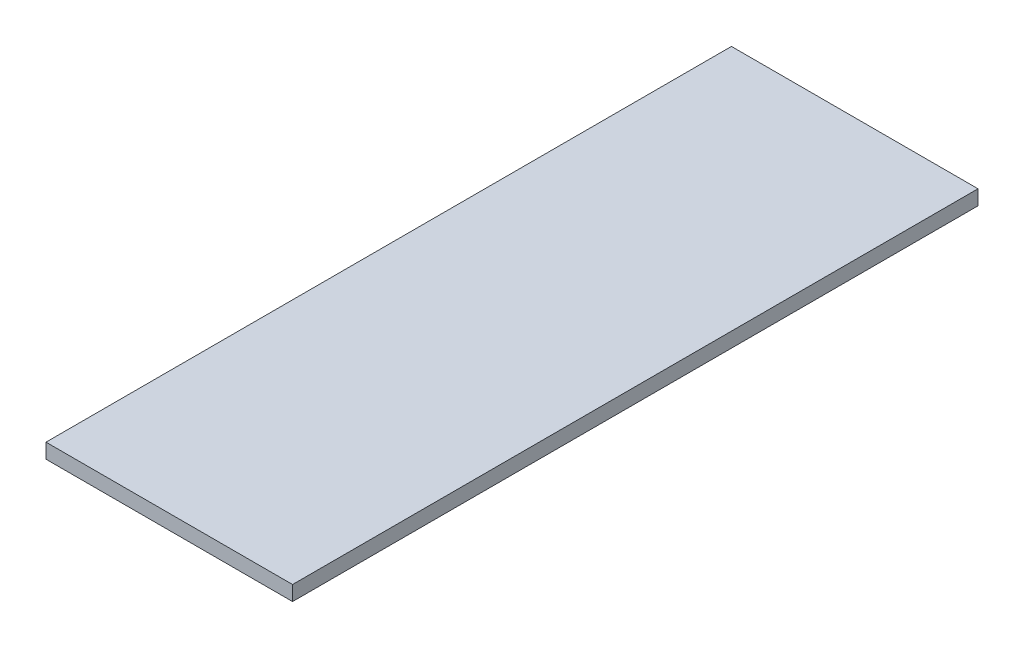
ISO-10303-21;
HEADER;
FILE_DESCRIPTION(('STEP AP214'),'2;1');
FILE_NAME('part.step','',(''),(''),'','','');
FILE_SCHEMA(('AUTOMOTIVE_DESIGN { 1 0 10303 214 1 1 1 1 }'));
ENDSEC;
DATA;
#1=APPLICATION_CONTEXT('core data for automotive mechanical design processes');
#2=APPLICATION_PROTOCOL_DEFINITION('international standard','automotive_design',2000,#1);
#3=PRODUCT_CONTEXT('',#1,'mechanical');
#4=PRODUCT('Part','Part','',(#3));
#5=PRODUCT_RELATED_PRODUCT_CATEGORY('part','',(#4));
#6=PRODUCT_DEFINITION_FORMATION('','',#4);
#7=PRODUCT_DEFINITION_CONTEXT('part definition',#1,'design');
#8=PRODUCT_DEFINITION('design','',#6,#7);
#9=PRODUCT_DEFINITION_SHAPE('','',#8);
#10=(LENGTH_UNIT() NAMED_UNIT(*) SI_UNIT(.MILLI.,.METRE.));
#11=(NAMED_UNIT(*) PLANE_ANGLE_UNIT() SI_UNIT($,.RADIAN.));
#12=(NAMED_UNIT(*) SI_UNIT($,.STERADIAN.) SOLID_ANGLE_UNIT());
#13=UNCERTAINTY_MEASURE_WITH_UNIT(LENGTH_MEASURE(1.E-05),#10,'distance_accuracy_value','');
#14=(GEOMETRIC_REPRESENTATION_CONTEXT(3) GLOBAL_UNCERTAINTY_ASSIGNED_CONTEXT((#13)) GLOBAL_UNIT_ASSIGNED_CONTEXT((#10,
#11,#12)) REPRESENTATION_CONTEXT('',''));
#15=CARTESIAN_POINT('',(0.,0.,0.));
#16=DIRECTION('',(0.,0.,1.));
#17=DIRECTION('',(1.,0.,0.));
#18=AXIS2_PLACEMENT_3D('',#15,#16,#17);
#19=CARTESIAN_POINT('',(-158.75,19.05,-441.325));
#20=DIRECTION('',(1.,0.,0.));
#21=DIRECTION('',(0.,0.,-1.));
#22=AXIS2_PLACEMENT_3D('',#19,#20,#21);
#23=PLANE('',#22);
#24=DIRECTION('',(0.,0.,1.));
#25=VECTOR('',#24,1.);
#26=CARTESIAN_POINT('',(-158.75,0.,-441.325));
#27=LINE('',#26,#25);
#28=CARTESIAN_POINT('',(-158.75,0.,-441.325));
#29=VERTEX_POINT('',#28);
#30=CARTESIAN_POINT('',(-158.75,0.,441.325));
#31=VERTEX_POINT('',#30);
#32=EDGE_CURVE('E95',#29,#31,#27,.T.);
#33=ORIENTED_EDGE('',*,*,#32,.T.);
#34=DIRECTION('',(0.,-1.,0.));
#35=VECTOR('',#34,1.);
#36=CARTESIAN_POINT('',(-158.75,19.05,441.325));
#37=LINE('',#36,#35);
#38=CARTESIAN_POINT('',(-158.75,19.05,441.325));
#39=VERTEX_POINT('',#38);
#40=EDGE_CURVE('E11',#39,#31,#37,.T.);
#41=ORIENTED_EDGE('',*,*,#40,.F.);
#42=DIRECTION('',(0.,0.,1.));
#43=VECTOR('',#42,1.);
#44=CARTESIAN_POINT('',(-158.75,19.05,-441.325));
#45=LINE('',#44,#43);
#46=CARTESIAN_POINT('',(-158.75,19.05,-441.325));
#47=VERTEX_POINT('',#46);
#48=EDGE_CURVE('E83',#47,#39,#45,.T.);
#49=ORIENTED_EDGE('',*,*,#48,.F.);
#50=DIRECTION('',(0.,-1.,0.));
#51=VECTOR('',#50,1.);
#52=CARTESIAN_POINT('',(-158.75,19.05,-441.325));
#53=LINE('',#52,#51);
#54=EDGE_CURVE('E91',#47,#29,#53,.T.);
#55=ORIENTED_EDGE('',*,*,#54,.T.);
#56=EDGE_LOOP('',(#33,#41,#49,#55));
#57=FACE_BOUND('',#56,.T.);
#58=ADVANCED_FACE('F32',(#57),#23,.F.);
#59=CARTESIAN_POINT('',(158.75,19.05,441.325));
#60=DIRECTION('',(0.,0.,-1.));
#61=DIRECTION('',(-1.,0.,0.));
#62=AXIS2_PLACEMENT_3D('',#59,#60,#61);
#63=PLANE('',#62);
#64=DIRECTION('',(1.,0.,0.));
#65=VECTOR('',#64,1.);
#66=CARTESIAN_POINT('',(158.75,0.,441.325));
#67=LINE('',#66,#65);
#68=CARTESIAN_POINT('',(158.75,0.,441.325));
#69=VERTEX_POINT('',#68);
#70=EDGE_CURVE('E87',#31,#69,#67,.T.);
#71=ORIENTED_EDGE('',*,*,#70,.T.);
#72=DIRECTION('',(0.,-1.,0.));
#73=VECTOR('',#72,1.);
#74=CARTESIAN_POINT('',(158.75,19.05,441.325));
#75=LINE('',#74,#73);
#76=CARTESIAN_POINT('',(158.75,19.05,441.325));
#77=VERTEX_POINT('',#76);
#78=EDGE_CURVE('E40',#77,#69,#75,.T.);
#79=ORIENTED_EDGE('',*,*,#78,.F.);
#80=DIRECTION('',(1.,0.,0.));
#81=VECTOR('',#80,1.);
#82=CARTESIAN_POINT('',(158.75,19.05,441.325));
#83=LINE('',#82,#81);
#84=EDGE_CURVE('E78',#39,#77,#83,.T.);
#85=ORIENTED_EDGE('',*,*,#84,.F.);
#86=ORIENTED_EDGE('',*,*,#40,.T.);
#87=EDGE_LOOP('',(#71,#79,#85,#86));
#88=FACE_BOUND('',#87,.T.);
#89=ADVANCED_FACE('F86',(#88),#63,.F.);
#90=CARTESIAN_POINT('',(158.75,19.05,-441.325));
#91=DIRECTION('',(-1.,0.,0.));
#92=DIRECTION('',(0.,0.,1.));
#93=AXIS2_PLACEMENT_3D('',#90,#91,#92);
#94=PLANE('',#93);
#95=DIRECTION('',(0.,0.,-1.));
#96=VECTOR('',#95,1.);
#97=CARTESIAN_POINT('',(158.75,0.,-441.325));
#98=LINE('',#97,#96);
#99=CARTESIAN_POINT('',(158.75,0.,-441.325));
#100=VERTEX_POINT('',#99);
#101=EDGE_CURVE('E65',#69,#100,#98,.T.);
#102=ORIENTED_EDGE('',*,*,#101,.T.);
#103=DIRECTION('',(0.,-1.,0.));
#104=VECTOR('',#103,1.);
#105=CARTESIAN_POINT('',(158.75,19.05,-441.325));
#106=LINE('',#105,#104);
#107=CARTESIAN_POINT('',(158.75,19.05,-441.325));
#108=VERTEX_POINT('',#107);
#109=EDGE_CURVE('E88',#108,#100,#106,.T.);
#110=ORIENTED_EDGE('',*,*,#109,.F.);
#111=DIRECTION('',(0.,0.,-1.));
#112=VECTOR('',#111,1.);
#113=CARTESIAN_POINT('',(158.75,19.05,-441.325));
#114=LINE('',#113,#112);
#115=EDGE_CURVE('E81',#77,#108,#114,.T.);
#116=ORIENTED_EDGE('',*,*,#115,.F.);
#117=ORIENTED_EDGE('',*,*,#78,.T.);
#118=EDGE_LOOP('',(#102,#110,#116,#117));
#119=FACE_BOUND('',#118,.T.);
#120=ADVANCED_FACE('F89',(#119),#94,.F.);
#121=CARTESIAN_POINT('',(158.75,19.05,-441.325));
#122=DIRECTION('',(0.,0.,1.));
#123=DIRECTION('',(1.,0.,0.));
#124=AXIS2_PLACEMENT_3D('',#121,#122,#123);
#125=PLANE('',#124);
#126=DIRECTION('',(-1.,0.,0.));
#127=VECTOR('',#126,1.);
#128=CARTESIAN_POINT('',(158.75,0.,-441.325));
#129=LINE('',#128,#127);
#130=EDGE_CURVE('E71',#100,#29,#129,.T.);
#131=ORIENTED_EDGE('',*,*,#130,.T.);
#132=ORIENTED_EDGE('',*,*,#54,.F.);
#133=DIRECTION('',(-1.,0.,0.));
#134=VECTOR('',#133,1.);
#135=CARTESIAN_POINT('',(158.75,19.05,-441.325));
#136=LINE('',#135,#134);
#137=EDGE_CURVE('E48',#108,#47,#136,.T.);
#138=ORIENTED_EDGE('',*,*,#137,.F.);
#139=ORIENTED_EDGE('',*,*,#109,.T.);
#140=EDGE_LOOP('',(#131,#132,#138,#139));
#141=FACE_BOUND('',#140,.T.);
#142=ADVANCED_FACE('F102',(#141),#125,.F.);
#143=CARTESIAN_POINT('',(0.,19.05,0.));
#144=DIRECTION('',(0.,-1.,0.));
#145=DIRECTION('',(0.,0.,-1.));
#146=AXIS2_PLACEMENT_3D('',#143,#144,#145);
#147=PLANE('',#146);
#148=ORIENTED_EDGE('',*,*,#48,.T.);
#149=ORIENTED_EDGE('',*,*,#84,.T.);
#150=ORIENTED_EDGE('',*,*,#115,.T.);
#151=ORIENTED_EDGE('',*,*,#137,.T.);
#152=EDGE_LOOP('',(#148,#149,#150,#151));
#153=FACE_BOUND('',#152,.T.);
#154=ADVANCED_FACE('F79',(#153),#147,.F.);
#155=CARTESIAN_POINT('',(0.,0.,0.));
#156=DIRECTION('',(0.,-1.,0.));
#157=DIRECTION('',(0.,0.,-1.));
#158=AXIS2_PLACEMENT_3D('',#155,#156,#157);
#159=PLANE('',#158);
#160=ORIENTED_EDGE('',*,*,#32,.F.);
#161=ORIENTED_EDGE('',*,*,#130,.F.);
#162=ORIENTED_EDGE('',*,*,#101,.F.);
#163=ORIENTED_EDGE('',*,*,#70,.F.);
#164=EDGE_LOOP('',(#160,#161,#162,#163));
#165=FACE_BOUND('',#164,.T.);
#166=ADVANCED_FACE('F105',(#165),#159,.T.);
#167=CLOSED_SHELL('',(#58,#89,#120,#142,#154,#166));
#168=MANIFOLD_SOLID_BREP('B2',#167);
#169=ADVANCED_BREP_SHAPE_REPRESENTATION('',(#18,#168),#14);
#170=SHAPE_DEFINITION_REPRESENTATION(#9,#169);
ENDSEC;
END-ISO-10303-21;
